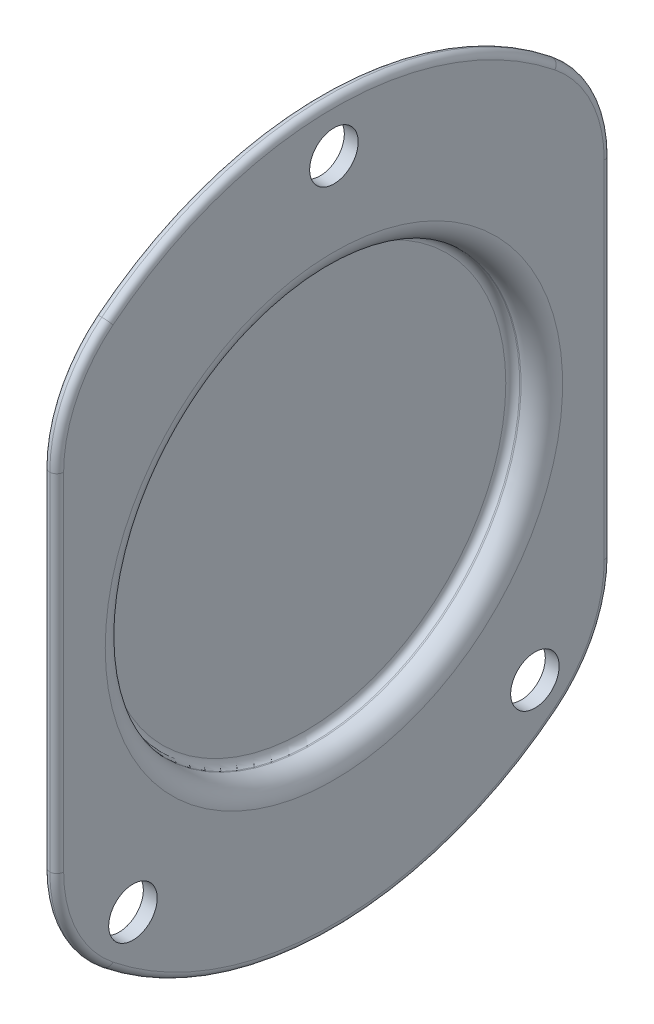
ISO-10303-21;
HEADER;
FILE_DESCRIPTION(('STEP AP214'),'2;1');
FILE_NAME('part.step','',(''),(''),'','','');
FILE_SCHEMA(('AUTOMOTIVE_DESIGN { 1 0 10303 214 1 1 1 1 }'));
ENDSEC;
DATA;
#1=APPLICATION_CONTEXT('core data for automotive mechanical design processes');
#2=APPLICATION_PROTOCOL_DEFINITION('international standard','automotive_design',2000,#1);
#3=PRODUCT_CONTEXT('',#1,'mechanical');
#4=PRODUCT('Part','Part','',(#3));
#5=PRODUCT_RELATED_PRODUCT_CATEGORY('part','',(#4));
#6=PRODUCT_DEFINITION_FORMATION('','',#4);
#7=PRODUCT_DEFINITION_CONTEXT('part definition',#1,'design');
#8=PRODUCT_DEFINITION('design','',#6,#7);
#9=PRODUCT_DEFINITION_SHAPE('','',#8);
#10=(LENGTH_UNIT() NAMED_UNIT(*) SI_UNIT(.MILLI.,.METRE.));
#11=(NAMED_UNIT(*) PLANE_ANGLE_UNIT() SI_UNIT($,.RADIAN.));
#12=(NAMED_UNIT(*) SI_UNIT($,.STERADIAN.) SOLID_ANGLE_UNIT());
#13=UNCERTAINTY_MEASURE_WITH_UNIT(LENGTH_MEASURE(1.E-05),#10,'distance_accuracy_value','');
#14=(GEOMETRIC_REPRESENTATION_CONTEXT(3) GLOBAL_UNCERTAINTY_ASSIGNED_CONTEXT((#13)) GLOBAL_UNIT_ASSIGNED_CONTEXT((#10,
#11,#12)) REPRESENTATION_CONTEXT('',''));
#15=CARTESIAN_POINT('',(0.,0.,0.));
#16=DIRECTION('',(0.,0.,1.));
#17=DIRECTION('',(1.,0.,0.));
#18=AXIS2_PLACEMENT_3D('',#15,#16,#17);
#19=CARTESIAN_POINT('',(2.2,52.,0.));
#20=DIRECTION('',(1.,0.,0.));
#21=DIRECTION('',(0.,0.,-1.));
#22=AXIS2_PLACEMENT_3D('',#19,#20,#21);
#23=PLANE('',#22);
#24=DIRECTION('',(0.,-1.,0.));
#25=VECTOR('',#24,1.);
#26=CARTESIAN_POINT('',(2.2,24.9799919935936,39.));
#27=LINE('',#26,#25);
#28=CARTESIAN_POINT('',(2.2,-24.9799919935936,39.));
#29=VERTEX_POINT('',#28);
#30=CARTESIAN_POINT('',(2.2,24.9799919935936,39.));
#31=VERTEX_POINT('',#30);
#32=EDGE_CURVE('E222',#29,#31,#27,.F.);
#33=ORIENTED_EDGE('',*,*,#32,.T.);
#34=CARTESIAN_POINT('',(2.2,24.9799919935936,20.));
#35=DIRECTION('',(1.,0.,0.));
#36=DIRECTION('',(0.,0.,-1.));
#37=AXIS2_PLACEMENT_3D('',#34,#35,#36);
#38=CIRCLE('',#37,19.);
#39=CARTESIAN_POINT('',(2.2,39.8118622397898,31.875));
#40=VERTEX_POINT('',#39);
#41=EDGE_CURVE('E224',#31,#40,#38,.F.);
#42=ORIENTED_EDGE('',*,*,#41,.T.);
#43=CARTESIAN_POINT('',(2.2,0.,0.));
#44=DIRECTION('',(1.,0.,0.));
#45=DIRECTION('',(0.,0.,-1.));
#46=AXIS2_PLACEMENT_3D('',#43,#44,#45);
#47=CIRCLE('',#46,51.);
#48=CARTESIAN_POINT('',(2.2,39.8118622397898,-31.875));
#49=VERTEX_POINT('',#48);
#50=EDGE_CURVE('E210',#40,#49,#47,.F.);
#51=ORIENTED_EDGE('',*,*,#50,.T.);
#52=CARTESIAN_POINT('',(2.2,24.9799919935936,-20.));
#53=DIRECTION('',(1.,0.,0.));
#54=DIRECTION('',(0.,0.,-1.));
#55=AXIS2_PLACEMENT_3D('',#52,#53,#54);
#56=CIRCLE('',#55,19.);
#57=CARTESIAN_POINT('',(2.2,24.9799919935936,-39.));
#58=VERTEX_POINT('',#57);
#59=EDGE_CURVE('E212',#49,#58,#56,.F.);
#60=ORIENTED_EDGE('',*,*,#59,.T.);
#61=DIRECTION('',(0.,1.,0.));
#62=VECTOR('',#61,1.);
#63=CARTESIAN_POINT('',(2.2,-24.9799919935936,-39.));
#64=LINE('',#63,#62);
#65=CARTESIAN_POINT('',(2.2,-24.9799919935936,-39.));
#66=VERTEX_POINT('',#65);
#67=EDGE_CURVE('E214',#58,#66,#64,.F.);
#68=ORIENTED_EDGE('',*,*,#67,.T.);
#69=CARTESIAN_POINT('',(2.2,-24.9799919935936,-20.));
#70=DIRECTION('',(1.,0.,0.));
#71=DIRECTION('',(0.,0.,-1.));
#72=AXIS2_PLACEMENT_3D('',#69,#70,#71);
#73=CIRCLE('',#72,19.);
#74=CARTESIAN_POINT('',(2.2,-39.8118622397898,-31.875));
#75=VERTEX_POINT('',#74);
#76=EDGE_CURVE('E216',#66,#75,#73,.F.);
#77=ORIENTED_EDGE('',*,*,#76,.T.);
#78=CARTESIAN_POINT('',(2.2,0.,0.));
#79=DIRECTION('',(1.,0.,0.));
#80=DIRECTION('',(0.,0.,-1.));
#81=AXIS2_PLACEMENT_3D('',#78,#79,#80);
#82=CIRCLE('',#81,51.);
#83=CARTESIAN_POINT('',(2.2,-39.8118622397898,31.875));
#84=VERTEX_POINT('',#83);
#85=EDGE_CURVE('E218',#75,#84,#82,.F.);
#86=ORIENTED_EDGE('',*,*,#85,.T.);
#87=CARTESIAN_POINT('',(2.2,-24.9799919935936,20.));
#88=DIRECTION('',(1.,0.,0.));
#89=DIRECTION('',(0.,0.,-1.));
#90=AXIS2_PLACEMENT_3D('',#87,#88,#89);
#91=CIRCLE('',#90,19.);
#92=EDGE_CURVE('E220',#84,#29,#91,.F.);
#93=ORIENTED_EDGE('',*,*,#92,.T.);
#94=EDGE_LOOP('',(#33,#42,#51,#60,#68,#77,#86,#93));
#95=FACE_BOUND('',#94,.T.);
#96=CARTESIAN_POINT('',(2.2,-35.,-29.));
#97=DIRECTION('',(1.,0.,0.));
#98=DIRECTION('',(0.,0.,-1.));
#99=AXIS2_PLACEMENT_3D('',#96,#97,#98);
#100=CIRCLE('',#99,3.5);
#101=CARTESIAN_POINT('',(2.2,-35.,-32.5));
#102=VERTEX_POINT('',#101);
#103=EDGE_CURVE('E167',#102,#102,#100,.T.);
#104=ORIENTED_EDGE('',*,*,#103,.T.);
#105=EDGE_LOOP('',(#104));
#106=FACE_BOUND('',#105,.T.);
#107=CARTESIAN_POINT('',(2.2,-35.,29.));
#108=DIRECTION('',(1.,0.,0.));
#109=DIRECTION('',(0.,0.,-1.));
#110=AXIS2_PLACEMENT_3D('',#107,#108,#109);
#111=CIRCLE('',#110,3.5);
#112=CARTESIAN_POINT('',(2.2,-35.,25.5));
#113=VERTEX_POINT('',#112);
#114=EDGE_CURVE('E177',#113,#113,#111,.T.);
#115=ORIENTED_EDGE('',*,*,#114,.T.);
#116=EDGE_LOOP('',(#115));
#117=FACE_BOUND('',#116,.T.);
#118=CARTESIAN_POINT('',(2.2,45.,0.));
#119=DIRECTION('',(1.,0.,0.));
#120=DIRECTION('',(0.,0.,-1.));
#121=AXIS2_PLACEMENT_3D('',#118,#119,#120);
#122=CIRCLE('',#121,3.5);
#123=CARTESIAN_POINT('',(2.2,45.,-3.5));
#124=VERTEX_POINT('',#123);
#125=EDGE_CURVE('E183',#124,#124,#122,.T.);
#126=ORIENTED_EDGE('',*,*,#125,.T.);
#127=EDGE_LOOP('',(#126));
#128=FACE_BOUND('',#127,.T.);
#129=CARTESIAN_POINT('',(2.2,0.,0.));
#130=DIRECTION('',(-1.,0.,0.));
#131=DIRECTION('',(0.,0.,1.));
#132=AXIS2_PLACEMENT_3D('',#129,#130,#131);
#133=CIRCLE('',#132,33.);
#134=CARTESIAN_POINT('',(2.2,0.,33.));
#135=VERTEX_POINT('',#134);
#136=EDGE_CURVE('E198',#135,#135,#133,.T.);
#137=ORIENTED_EDGE('',*,*,#136,.F.);
#138=EDGE_LOOP('',(#137));
#139=FACE_BOUND('',#138,.T.);
#140=ADVANCED_FACE('F34',(#95,#106,#117,#128,#139),#23,.F.);
#141=CARTESIAN_POINT('',(4.2,33.,0.));
#142=DIRECTION('',(-1.,0.,0.));
#143=DIRECTION('',(0.,0.,1.));
#144=AXIS2_PLACEMENT_3D('',#141,#142,#143);
#145=PLANE('',#144);
#146=CARTESIAN_POINT('',(4.2,0.,0.));
#147=DIRECTION('',(-1.,0.,0.));
#148=DIRECTION('',(0.,0.,1.));
#149=AXIS2_PLACEMENT_3D('',#146,#147,#148);
#150=CIRCLE('',#149,51.);
#151=CARTESIAN_POINT('',(4.2,39.8118622397898,-31.875));
#152=VERTEX_POINT('',#151);
#153=CARTESIAN_POINT('',(4.2,39.8118622397898,31.875));
#154=VERTEX_POINT('',#153);
#155=EDGE_CURVE('E227',#152,#154,#150,.F.);
#156=ORIENTED_EDGE('',*,*,#155,.T.);
#157=CARTESIAN_POINT('',(4.2,24.9799919935936,20.));
#158=DIRECTION('',(-1.,0.,0.));
#159=DIRECTION('',(0.,0.,1.));
#160=AXIS2_PLACEMENT_3D('',#157,#158,#159);
#161=CIRCLE('',#160,19.);
#162=CARTESIAN_POINT('',(4.2,24.9799919935936,39.));
#163=VERTEX_POINT('',#162);
#164=EDGE_CURVE('E12',#154,#163,#161,.F.);
#165=ORIENTED_EDGE('',*,*,#164,.T.);
#166=DIRECTION('',(0.,1.,0.));
#167=VECTOR('',#166,1.);
#168=CARTESIAN_POINT('',(4.2,-24.9799919935936,39.));
#169=LINE('',#168,#167);
#170=CARTESIAN_POINT('',(4.2,-24.9799919935936,39.));
#171=VERTEX_POINT('',#170);
#172=EDGE_CURVE('E44',#163,#171,#169,.F.);
#173=ORIENTED_EDGE('',*,*,#172,.T.);
#174=CARTESIAN_POINT('',(4.2,-24.9799919935936,20.));
#175=DIRECTION('',(-1.,0.,0.));
#176=DIRECTION('',(0.,0.,1.));
#177=AXIS2_PLACEMENT_3D('',#174,#175,#176);
#178=CIRCLE('',#177,19.);
#179=CARTESIAN_POINT('',(4.2,-39.8118622397898,31.875));
#180=VERTEX_POINT('',#179);
#181=EDGE_CURVE('E134',#171,#180,#178,.F.);
#182=ORIENTED_EDGE('',*,*,#181,.T.);
#183=CARTESIAN_POINT('',(4.2,0.,0.));
#184=DIRECTION('',(-1.,0.,0.));
#185=DIRECTION('',(0.,0.,1.));
#186=AXIS2_PLACEMENT_3D('',#183,#184,#185);
#187=CIRCLE('',#186,51.);
#188=CARTESIAN_POINT('',(4.2,-39.8118622397898,-31.875));
#189=VERTEX_POINT('',#188);
#190=EDGE_CURVE('E138',#180,#189,#187,.F.);
#191=ORIENTED_EDGE('',*,*,#190,.T.);
#192=CARTESIAN_POINT('',(4.2,-24.9799919935936,-20.));
#193=DIRECTION('',(-1.,0.,0.));
#194=DIRECTION('',(0.,0.,1.));
#195=AXIS2_PLACEMENT_3D('',#192,#193,#194);
#196=CIRCLE('',#195,19.);
#197=CARTESIAN_POINT('',(4.2,-24.9799919935936,-39.));
#198=VERTEX_POINT('',#197);
#199=EDGE_CURVE('E148',#189,#198,#196,.F.);
#200=ORIENTED_EDGE('',*,*,#199,.T.);
#201=DIRECTION('',(0.,-1.,0.));
#202=VECTOR('',#201,1.);
#203=CARTESIAN_POINT('',(4.2,24.9799919935936,-39.));
#204=LINE('',#203,#202);
#205=CARTESIAN_POINT('',(4.2,24.9799919935936,-39.));
#206=VERTEX_POINT('',#205);
#207=EDGE_CURVE('E231',#198,#206,#204,.F.);
#208=ORIENTED_EDGE('',*,*,#207,.T.);
#209=CARTESIAN_POINT('',(4.2,24.9799919935936,-20.));
#210=DIRECTION('',(-1.,0.,0.));
#211=DIRECTION('',(0.,0.,1.));
#212=AXIS2_PLACEMENT_3D('',#209,#210,#211);
#213=CIRCLE('',#212,19.);
#214=EDGE_CURVE('E229',#206,#152,#213,.F.);
#215=ORIENTED_EDGE('',*,*,#214,.T.);
#216=EDGE_LOOP('',(#156,#165,#173,#182,#191,#200,#208,#215));
#217=FACE_BOUND('',#216,.T.);
#218=CARTESIAN_POINT('',(4.2,-35.,-29.));
#219=DIRECTION('',(1.,0.,0.));
#220=DIRECTION('',(0.,0.,-1.));
#221=AXIS2_PLACEMENT_3D('',#218,#219,#220);
#222=CIRCLE('',#221,3.5);
#223=CARTESIAN_POINT('',(4.2,-35.,-32.5));
#224=VERTEX_POINT('',#223);
#225=EDGE_CURVE('E165',#224,#224,#222,.T.);
#226=ORIENTED_EDGE('',*,*,#225,.F.);
#227=EDGE_LOOP('',(#226));
#228=FACE_BOUND('',#227,.T.);
#229=CARTESIAN_POINT('',(4.2,-35.,29.));
#230=DIRECTION('',(1.,0.,0.));
#231=DIRECTION('',(0.,0.,-1.));
#232=AXIS2_PLACEMENT_3D('',#229,#230,#231);
#233=CIRCLE('',#232,3.5);
#234=CARTESIAN_POINT('',(4.2,-35.,25.5));
#235=VERTEX_POINT('',#234);
#236=EDGE_CURVE('E172',#235,#235,#233,.T.);
#237=ORIENTED_EDGE('',*,*,#236,.F.);
#238=EDGE_LOOP('',(#237));
#239=FACE_BOUND('',#238,.T.);
#240=CARTESIAN_POINT('',(4.2,45.,0.));
#241=DIRECTION('',(1.,0.,0.));
#242=DIRECTION('',(0.,0.,-1.));
#243=AXIS2_PLACEMENT_3D('',#240,#241,#242);
#244=CIRCLE('',#243,3.5);
#245=CARTESIAN_POINT('',(4.2,45.,-3.5));
#246=VERTEX_POINT('',#245);
#247=EDGE_CURVE('E180',#246,#246,#244,.T.);
#248=ORIENTED_EDGE('',*,*,#247,.F.);
#249=EDGE_LOOP('',(#248));
#250=FACE_BOUND('',#249,.T.);
#251=CARTESIAN_POINT('',(4.2,0.,0.));
#252=DIRECTION('',(-1.,0.,0.));
#253=DIRECTION('',(0.,0.,1.));
#254=AXIS2_PLACEMENT_3D('',#251,#252,#253);
#255=CIRCLE('',#254,33.);
#256=CARTESIAN_POINT('',(4.2,0.,33.));
#257=VERTEX_POINT('',#256);
#258=EDGE_CURVE('E195',#257,#257,#255,.T.);
#259=ORIENTED_EDGE('',*,*,#258,.T.);
#260=EDGE_LOOP('',(#259));
#261=FACE_BOUND('',#260,.T.);
#262=ADVANCED_FACE('F136',(#217,#228,#239,#250,#261),#145,.F.);
#263=CARTESIAN_POINT('',(-2.,29.,0.));
#264=DIRECTION('',(1.,0.,0.));
#265=DIRECTION('',(0.,0.,-1.));
#266=AXIS2_PLACEMENT_3D('',#263,#264,#265);
#267=PLANE('',#266);
#268=CARTESIAN_POINT('',(-2.,0.,0.));
#269=DIRECTION('',(-1.,0.,0.));
#270=DIRECTION('',(0.,0.,1.));
#271=AXIS2_PLACEMENT_3D('',#268,#269,#270);
#272=CIRCLE('',#271,29.);
#273=CARTESIAN_POINT('',(-2.,0.,29.));
#274=VERTEX_POINT('',#273);
#275=EDGE_CURVE('E207',#274,#274,#272,.T.);
#276=ORIENTED_EDGE('',*,*,#275,.T.);
#277=EDGE_LOOP('',(#276));
#278=FACE_BOUND('',#277,.T.);
#279=ADVANCED_FACE('F313',(#278),#267,.F.);
#280=CARTESIAN_POINT('',(1.,0.,0.));
#281=DIRECTION('',(-1.,0.,0.));
#282=DIRECTION('',(0.,0.,1.));
#283=AXIS2_PLACEMENT_3D('',#280,#281,#282);
#284=TOROIDAL_SURFACE('',#283,29.,3.);
#285=ORIENTED_EDGE('',*,*,#275,.F.);
#286=EDGE_LOOP('',(#285));
#287=FACE_BOUND('',#286,.T.);
#288=CARTESIAN_POINT('',(1.00000000000002,0.,0.));
#289=DIRECTION('',(-1.,0.,0.));
#290=DIRECTION('',(0.,0.,1.));
#291=AXIS2_PLACEMENT_3D('',#288,#289,#290);
#292=CIRCLE('',#291,32.);
#293=CARTESIAN_POINT('',(1.00000000000002,0.,32.));
#294=VERTEX_POINT('',#293);
#295=EDGE_CURVE('E204',#294,#294,#292,.T.);
#296=ORIENTED_EDGE('',*,*,#295,.T.);
#297=EDGE_LOOP('',(#296));
#298=FACE_BOUND('',#297,.T.);
#299=ADVANCED_FACE('F326',(#287,#298),#284,.T.);
#300=CARTESIAN_POINT('',(-2.,0.,0.));
#301=DIRECTION('',(-1.,0.,0.));
#302=DIRECTION('',(0.,0.,1.));
#303=AXIS2_PLACEMENT_3D('',#300,#301,#302);
#304=CYLINDRICAL_SURFACE('',#303,32.);
#305=ORIENTED_EDGE('',*,*,#295,.F.);
#306=EDGE_LOOP('',(#305));
#307=FACE_BOUND('',#306,.T.);
#308=CARTESIAN_POINT('',(1.2,0.,0.));
#309=DIRECTION('',(-1.,0.,0.));
#310=DIRECTION('',(0.,0.,1.));
#311=AXIS2_PLACEMENT_3D('',#308,#309,#310);
#312=CIRCLE('',#311,32.);
#313=CARTESIAN_POINT('',(1.2,0.,32.));
#314=VERTEX_POINT('',#313);
#315=EDGE_CURVE('E201',#314,#314,#312,.T.);
#316=ORIENTED_EDGE('',*,*,#315,.T.);
#317=EDGE_LOOP('',(#316));
#318=FACE_BOUND('',#317,.T.);
#319=ADVANCED_FACE('F322',(#307,#318),#304,.T.);
#320=CARTESIAN_POINT('',(1.2,0.,0.));
#321=DIRECTION('',(-1.,0.,0.));
#322=DIRECTION('',(0.,0.,1.));
#323=AXIS2_PLACEMENT_3D('',#320,#321,#322);
#324=TOROIDAL_SURFACE('',#323,33.,1.);
#325=ORIENTED_EDGE('',*,*,#315,.F.);
#326=EDGE_LOOP('',(#325));
#327=FACE_BOUND('',#326,.T.);
#328=ORIENTED_EDGE('',*,*,#136,.T.);
#329=EDGE_LOOP('',(#328));
#330=FACE_BOUND('',#329,.T.);
#331=ADVANCED_FACE('F318',(#327,#330),#324,.F.);
#332=CARTESIAN_POINT('',(1.2,0.,0.));
#333=DIRECTION('',(-1.,0.,0.));
#334=DIRECTION('',(0.,0.,1.));
#335=AXIS2_PLACEMENT_3D('',#332,#333,#334);
#336=TOROIDAL_SURFACE('',#335,33.,3.);
#337=ORIENTED_EDGE('',*,*,#258,.F.);
#338=EDGE_LOOP('',(#337));
#339=FACE_BOUND('',#338,.T.);
#340=CARTESIAN_POINT('',(1.19999999999998,0.,0.));
#341=DIRECTION('',(-1.,0.,0.));
#342=DIRECTION('',(0.,0.,1.));
#343=AXIS2_PLACEMENT_3D('',#340,#341,#342);
#344=CIRCLE('',#343,30.);
#345=CARTESIAN_POINT('',(1.19999999999998,0.,30.));
#346=VERTEX_POINT('',#345);
#347=EDGE_CURVE('E192',#346,#346,#344,.T.);
#348=ORIENTED_EDGE('',*,*,#347,.T.);
#349=EDGE_LOOP('',(#348));
#350=FACE_BOUND('',#349,.T.);
#351=ADVANCED_FACE('F321',(#339,#350),#336,.T.);
#352=CARTESIAN_POINT('',(-2.,0.,0.));
#353=DIRECTION('',(-1.,0.,0.));
#354=DIRECTION('',(0.,0.,1.));
#355=AXIS2_PLACEMENT_3D('',#352,#353,#354);
#356=CYLINDRICAL_SURFACE('',#355,30.);
#357=ORIENTED_EDGE('',*,*,#347,.F.);
#358=EDGE_LOOP('',(#357));
#359=FACE_BOUND('',#358,.T.);
#360=CARTESIAN_POINT('',(1.00000000000001,0.,0.));
#361=DIRECTION('',(-1.,0.,0.));
#362=DIRECTION('',(0.,0.,1.));
#363=AXIS2_PLACEMENT_3D('',#360,#361,#362);
#364=CIRCLE('',#363,30.);
#365=CARTESIAN_POINT('',(1.00000000000001,0.,30.));
#366=VERTEX_POINT('',#365);
#367=EDGE_CURVE('E189',#366,#366,#364,.T.);
#368=ORIENTED_EDGE('',*,*,#367,.T.);
#369=EDGE_LOOP('',(#368));
#370=FACE_BOUND('',#369,.T.);
#371=ADVANCED_FACE('F516',(#359,#370),#356,.F.);
#372=CARTESIAN_POINT('',(1.,0.,0.));
#373=DIRECTION('',(-1.,0.,0.));
#374=DIRECTION('',(0.,0.,1.));
#375=AXIS2_PLACEMENT_3D('',#372,#373,#374);
#376=TOROIDAL_SURFACE('',#375,29.,1.);
#377=ORIENTED_EDGE('',*,*,#367,.F.);
#378=EDGE_LOOP('',(#377));
#379=FACE_BOUND('',#378,.T.);
#380=CARTESIAN_POINT('',(0.,0.,0.));
#381=DIRECTION('',(-1.,0.,0.));
#382=DIRECTION('',(0.,0.,1.));
#383=AXIS2_PLACEMENT_3D('',#380,#381,#382);
#384=CIRCLE('',#383,29.);
#385=CARTESIAN_POINT('',(0.,0.,29.));
#386=VERTEX_POINT('',#385);
#387=EDGE_CURVE('E186',#386,#386,#384,.T.);
#388=ORIENTED_EDGE('',*,*,#387,.T.);
#389=EDGE_LOOP('',(#388));
#390=FACE_BOUND('',#389,.T.);
#391=ADVANCED_FACE('F507',(#379,#390),#376,.F.);
#392=CARTESIAN_POINT('',(0.,0.,0.));
#393=DIRECTION('',(-1.,0.,0.));
#394=DIRECTION('',(0.,0.,1.));
#395=AXIS2_PLACEMENT_3D('',#392,#393,#394);
#396=PLANE('',#395);
#397=ORIENTED_EDGE('',*,*,#387,.F.);
#398=EDGE_LOOP('',(#397));
#399=FACE_BOUND('',#398,.T.);
#400=ADVANCED_FACE('F490',(#399),#396,.F.);
#401=CARTESIAN_POINT('',(-5.8,45.,0.));
#402=DIRECTION('',(1.,0.,0.));
#403=DIRECTION('',(0.,0.,-1.));
#404=AXIS2_PLACEMENT_3D('',#401,#402,#403);
#405=CYLINDRICAL_SURFACE('',#404,3.5);
#406=ORIENTED_EDGE('',*,*,#247,.T.);
#407=EDGE_LOOP('',(#406));
#408=FACE_BOUND('',#407,.T.);
#409=ORIENTED_EDGE('',*,*,#125,.F.);
#410=EDGE_LOOP('',(#409));
#411=FACE_BOUND('',#410,.T.);
#412=ADVANCED_FACE('F481',(#408,#411),#405,.F.);
#413=CARTESIAN_POINT('',(-5.8,-35.,29.));
#414=DIRECTION('',(1.,0.,0.));
#415=DIRECTION('',(0.,0.,-1.));
#416=AXIS2_PLACEMENT_3D('',#413,#414,#415);
#417=CYLINDRICAL_SURFACE('',#416,3.5);
#418=ORIENTED_EDGE('',*,*,#236,.T.);
#419=EDGE_LOOP('',(#418));
#420=FACE_BOUND('',#419,.T.);
#421=ORIENTED_EDGE('',*,*,#114,.F.);
#422=EDGE_LOOP('',(#421));
#423=FACE_BOUND('',#422,.T.);
#424=ADVANCED_FACE('F306',(#420,#423),#417,.F.);
#425=CARTESIAN_POINT('',(-5.8,-35.,-29.));
#426=DIRECTION('',(1.,0.,0.));
#427=DIRECTION('',(0.,0.,-1.));
#428=AXIS2_PLACEMENT_3D('',#425,#426,#427);
#429=CYLINDRICAL_SURFACE('',#428,3.5);
#430=ORIENTED_EDGE('',*,*,#225,.T.);
#431=EDGE_LOOP('',(#430));
#432=FACE_BOUND('',#431,.T.);
#433=ORIENTED_EDGE('',*,*,#103,.F.);
#434=EDGE_LOOP('',(#433));
#435=FACE_BOUND('',#434,.T.);
#436=ADVANCED_FACE('F301',(#432,#435),#429,.F.);
#437=CARTESIAN_POINT('',(3.2,-24.9799919935936,-20.));
#438=DIRECTION('',(-1.,0.,0.));
#439=DIRECTION('',(0.,0.,1.));
#440=AXIS2_PLACEMENT_3D('',#437,#438,#439);
#441=TOROIDAL_SURFACE('',#440,19.,1.);
#442=CARTESIAN_POINT('',(3.2,-24.9799919935936,-39.));
#443=DIRECTION('',(0.,1.,0.));
#444=DIRECTION('',(0.,0.,1.));
#445=AXIS2_PLACEMENT_3D('',#442,#443,#444);
#446=CIRCLE('',#445,1.);
#447=CARTESIAN_POINT('',(3.2,-24.9799919935936,-40.));
#448=VERTEX_POINT('',#447);
#449=EDGE_CURVE('E155',#198,#448,#446,.T.);
#450=ORIENTED_EDGE('',*,*,#449,.F.);
#451=ORIENTED_EDGE('',*,*,#199,.F.);
#452=CARTESIAN_POINT('',(3.2,-39.8118622397898,-31.875));
#453=DIRECTION('',(0.,-0.625000000000001,0.780624749799799));
#454=DIRECTION('',(0.,-0.780624749799799,-0.625000000000001));
#455=AXIS2_PLACEMENT_3D('',#452,#453,#454);
#456=CIRCLE('',#455,1.);
#457=CARTESIAN_POINT('',(3.2,-40.5924869895896,-32.5));
#458=VERTEX_POINT('',#457);
#459=EDGE_CURVE('E38',#458,#189,#456,.T.);
#460=ORIENTED_EDGE('',*,*,#459,.F.);
#461=CARTESIAN_POINT('',(3.2,-24.9799919935936,-20.));
#462=DIRECTION('',(-1.,0.,0.));
#463=DIRECTION('',(0.,0.,1.));
#464=AXIS2_PLACEMENT_3D('',#461,#462,#463);
#465=CIRCLE('',#464,20.);
#466=EDGE_CURVE('E82',#448,#458,#465,.T.);
#467=ORIENTED_EDGE('',*,*,#466,.F.);
#468=EDGE_LOOP('',(#450,#451,#460,#467));
#469=FACE_BOUND('',#468,.T.);
#470=ADVANCED_FACE('F36',(#469),#441,.T.);
#471=CARTESIAN_POINT('',(3.2,0.,0.));
#472=DIRECTION('',(-1.,0.,0.));
#473=DIRECTION('',(0.,0.,1.));
#474=AXIS2_PLACEMENT_3D('',#471,#472,#473);
#475=TOROIDAL_SURFACE('',#474,51.,1.);
#476=ORIENTED_EDGE('',*,*,#459,.T.);
#477=ORIENTED_EDGE('',*,*,#190,.F.);
#478=CARTESIAN_POINT('',(3.2,-39.8118622397898,31.875));
#479=DIRECTION('',(0.,0.625000000000001,0.780624749799799));
#480=DIRECTION('',(0.,-0.780624749799799,0.625000000000001));
#481=AXIS2_PLACEMENT_3D('',#478,#479,#480);
#482=CIRCLE('',#481,1.);
#483=CARTESIAN_POINT('',(3.2,-40.5924869895896,32.5));
#484=VERTEX_POINT('',#483);
#485=EDGE_CURVE('E146',#484,#180,#482,.T.);
#486=ORIENTED_EDGE('',*,*,#485,.F.);
#487=CARTESIAN_POINT('',(3.2,0.,0.));
#488=DIRECTION('',(-1.,0.,0.));
#489=DIRECTION('',(0.,0.,1.));
#490=AXIS2_PLACEMENT_3D('',#487,#488,#489);
#491=CIRCLE('',#490,52.);
#492=EDGE_CURVE('E156',#458,#484,#491,.T.);
#493=ORIENTED_EDGE('',*,*,#492,.F.);
#494=EDGE_LOOP('',(#476,#477,#486,#493));
#495=FACE_BOUND('',#494,.T.);
#496=ADVANCED_FACE('F144',(#495),#475,.T.);
#497=CARTESIAN_POINT('',(3.2,-24.9799919935936,-20.));
#498=DIRECTION('',(1.,0.,0.));
#499=DIRECTION('',(0.,0.,-1.));
#500=AXIS2_PLACEMENT_3D('',#497,#498,#499);
#501=TOROIDAL_SURFACE('',#500,19.,1.);
#502=CARTESIAN_POINT('',(3.2,-24.9799919935936,-39.));
#503=DIRECTION('',(0.,1.,0.));
#504=DIRECTION('',(0.,0.,1.));
#505=AXIS2_PLACEMENT_3D('',#502,#503,#504);
#506=CIRCLE('',#505,1.);
#507=EDGE_CURVE('E276',#448,#66,#506,.T.);
#508=ORIENTED_EDGE('',*,*,#507,.F.);
#509=ORIENTED_EDGE('',*,*,#466,.T.);
#510=CARTESIAN_POINT('',(3.2,-39.8118622397898,-31.875));
#511=DIRECTION('',(0.,-0.625000000000001,0.780624749799799));
#512=DIRECTION('',(0.,-0.780624749799799,-0.625000000000001));
#513=AXIS2_PLACEMENT_3D('',#510,#511,#512);
#514=CIRCLE('',#513,1.);
#515=EDGE_CURVE('E159',#75,#458,#514,.T.);
#516=ORIENTED_EDGE('',*,*,#515,.F.);
#517=ORIENTED_EDGE('',*,*,#76,.F.);
#518=EDGE_LOOP('',(#508,#509,#516,#517));
#519=FACE_BOUND('',#518,.T.);
#520=ADVANCED_FACE('F284',(#519),#501,.T.);
#521=CARTESIAN_POINT('',(3.2,52.,-39.));
#522=DIRECTION('',(0.,1.,0.));
#523=DIRECTION('',(0.,0.,1.));
#524=AXIS2_PLACEMENT_3D('',#521,#522,#523);
#525=CYLINDRICAL_SURFACE('',#524,1.);
#526=ORIENTED_EDGE('',*,*,#207,.F.);
#527=ORIENTED_EDGE('',*,*,#449,.T.);
#528=DIRECTION('',(0.,-1.,0.));
#529=VECTOR('',#528,1.);
#530=CARTESIAN_POINT('',(3.2,-24.9799919935936,-40.));
#531=LINE('',#530,#529);
#532=CARTESIAN_POINT('',(3.2,24.9799919935936,-40.));
#533=VERTEX_POINT('',#532);
#534=EDGE_CURVE('E273',#533,#448,#531,.T.);
#535=ORIENTED_EDGE('',*,*,#534,.F.);
#536=CARTESIAN_POINT('',(3.2,24.9799919935936,-39.));
#537=DIRECTION('',(0.,1.,0.));
#538=DIRECTION('',(0.,0.,1.));
#539=AXIS2_PLACEMENT_3D('',#536,#537,#538);
#540=CIRCLE('',#539,1.);
#541=EDGE_CURVE('E270',#206,#533,#540,.T.);
#542=ORIENTED_EDGE('',*,*,#541,.F.);
#543=EDGE_LOOP('',(#526,#527,#535,#542));
#544=FACE_BOUND('',#543,.T.);
#545=ADVANCED_FACE('F293',(#544),#525,.T.);
#546=CARTESIAN_POINT('',(3.2,-24.9799919935936,20.));
#547=DIRECTION('',(-1.,0.,0.));
#548=DIRECTION('',(0.,0.,1.));
#549=AXIS2_PLACEMENT_3D('',#546,#547,#548);
#550=TOROIDAL_SURFACE('',#549,19.,1.);
#551=ORIENTED_EDGE('',*,*,#485,.T.);
#552=ORIENTED_EDGE('',*,*,#181,.F.);
#553=CARTESIAN_POINT('',(3.2,-24.9799919935936,39.));
#554=DIRECTION('',(0.,1.,0.));
#555=DIRECTION('',(0.,0.,1.));
#556=AXIS2_PLACEMENT_3D('',#553,#554,#555);
#557=CIRCLE('',#556,1.);
#558=CARTESIAN_POINT('',(3.2,-24.9799919935936,40.));
#559=VERTEX_POINT('',#558);
#560=EDGE_CURVE('E268',#559,#171,#557,.T.);
#561=ORIENTED_EDGE('',*,*,#560,.F.);
#562=CARTESIAN_POINT('',(3.2,-24.9799919935936,20.));
#563=DIRECTION('',(-1.,0.,0.));
#564=DIRECTION('',(0.,0.,1.));
#565=AXIS2_PLACEMENT_3D('',#562,#563,#564);
#566=CIRCLE('',#565,20.);
#567=EDGE_CURVE('E153',#484,#559,#566,.T.);
#568=ORIENTED_EDGE('',*,*,#567,.F.);
#569=EDGE_LOOP('',(#551,#552,#561,#568));
#570=FACE_BOUND('',#569,.T.);
#571=ADVANCED_FACE('F151',(#570),#550,.T.);
#572=CARTESIAN_POINT('',(3.2,0.,0.));
#573=DIRECTION('',(1.,0.,0.));
#574=DIRECTION('',(0.,0.,-1.));
#575=AXIS2_PLACEMENT_3D('',#572,#573,#574);
#576=TOROIDAL_SURFACE('',#575,51.,1.);
#577=ORIENTED_EDGE('',*,*,#515,.T.);
#578=ORIENTED_EDGE('',*,*,#492,.T.);
#579=CARTESIAN_POINT('',(3.2,-39.8118622397898,31.875));
#580=DIRECTION('',(0.,0.625000000000001,0.780624749799799));
#581=DIRECTION('',(0.,-0.780624749799799,0.625000000000001));
#582=AXIS2_PLACEMENT_3D('',#579,#580,#581);
#583=CIRCLE('',#582,1.);
#584=EDGE_CURVE('E265',#84,#484,#583,.T.);
#585=ORIENTED_EDGE('',*,*,#584,.F.);
#586=ORIENTED_EDGE('',*,*,#85,.F.);
#587=EDGE_LOOP('',(#577,#578,#585,#586));
#588=FACE_BOUND('',#587,.T.);
#589=ADVANCED_FACE('F281',(#588),#576,.T.);
#590=CARTESIAN_POINT('',(3.2,52.,-39.));
#591=DIRECTION('',(0.,-1.,0.));
#592=DIRECTION('',(0.,0.,-1.));
#593=AXIS2_PLACEMENT_3D('',#590,#591,#592);
#594=CYLINDRICAL_SURFACE('',#593,1.);
#595=ORIENTED_EDGE('',*,*,#507,.T.);
#596=ORIENTED_EDGE('',*,*,#67,.F.);
#597=CARTESIAN_POINT('',(3.2,24.9799919935936,-39.));
#598=DIRECTION('',(0.,1.,0.));
#599=DIRECTION('',(0.,0.,1.));
#600=AXIS2_PLACEMENT_3D('',#597,#598,#599);
#601=CIRCLE('',#600,1.);
#602=EDGE_CURVE('E262',#533,#58,#601,.T.);
#603=ORIENTED_EDGE('',*,*,#602,.F.);
#604=ORIENTED_EDGE('',*,*,#534,.T.);
#605=EDGE_LOOP('',(#595,#596,#603,#604));
#606=FACE_BOUND('',#605,.T.);
#607=ADVANCED_FACE('F288',(#606),#594,.T.);
#608=CARTESIAN_POINT('',(3.2,24.9799919935936,-20.));
#609=DIRECTION('',(-1.,0.,0.));
#610=DIRECTION('',(0.,0.,1.));
#611=AXIS2_PLACEMENT_3D('',#608,#609,#610);
#612=TOROIDAL_SURFACE('',#611,19.,1.);
#613=ORIENTED_EDGE('',*,*,#214,.F.);
#614=ORIENTED_EDGE('',*,*,#541,.T.);
#615=CARTESIAN_POINT('',(3.2,24.9799919935936,-20.));
#616=DIRECTION('',(-1.,0.,0.));
#617=DIRECTION('',(0.,0.,1.));
#618=AXIS2_PLACEMENT_3D('',#615,#616,#617);
#619=CIRCLE('',#618,20.);
#620=CARTESIAN_POINT('',(3.2,40.5924869895896,-32.5));
#621=VERTEX_POINT('',#620);
#622=EDGE_CURVE('E259',#621,#533,#619,.T.);
#623=ORIENTED_EDGE('',*,*,#622,.F.);
#624=CARTESIAN_POINT('',(3.2,39.8118622397898,-31.875));
#625=DIRECTION('',(0.,0.625000000000001,0.780624749799799));
#626=DIRECTION('',(0.,-0.780624749799799,0.625000000000001));
#627=AXIS2_PLACEMENT_3D('',#624,#625,#626);
#628=CIRCLE('',#627,1.);
#629=EDGE_CURVE('E256',#152,#621,#628,.T.);
#630=ORIENTED_EDGE('',*,*,#629,.F.);
#631=EDGE_LOOP('',(#613,#614,#623,#630));
#632=FACE_BOUND('',#631,.T.);
#633=ADVANCED_FACE('F296',(#632),#612,.T.);
#634=CARTESIAN_POINT('',(3.2,52.,39.));
#635=DIRECTION('',(0.,-1.,0.));
#636=DIRECTION('',(0.,0.,-1.));
#637=AXIS2_PLACEMENT_3D('',#634,#635,#636);
#638=CYLINDRICAL_SURFACE('',#637,1.);
#639=ORIENTED_EDGE('',*,*,#560,.T.);
#640=ORIENTED_EDGE('',*,*,#172,.F.);
#641=CARTESIAN_POINT('',(3.2,24.9799919935936,39.));
#642=DIRECTION('',(0.,1.,0.));
#643=DIRECTION('',(0.,0.,1.));
#644=AXIS2_PLACEMENT_3D('',#641,#642,#643);
#645=CIRCLE('',#644,1.);
#646=CARTESIAN_POINT('',(3.2,24.9799919935936,40.));
#647=VERTEX_POINT('',#646);
#648=EDGE_CURVE('E53',#647,#163,#645,.T.);
#649=ORIENTED_EDGE('',*,*,#648,.F.);
#650=DIRECTION('',(0.,1.,0.));
#651=VECTOR('',#650,1.);
#652=CARTESIAN_POINT('',(3.2,24.9799919935936,40.));
#653=LINE('',#652,#651);
#654=EDGE_CURVE('E250',#559,#647,#653,.T.);
#655=ORIENTED_EDGE('',*,*,#654,.F.);
#656=EDGE_LOOP('',(#639,#640,#649,#655));
#657=FACE_BOUND('',#656,.T.);
#658=ADVANCED_FACE('F359',(#657),#638,.T.);
#659=CARTESIAN_POINT('',(3.2,-24.9799919935936,20.));
#660=DIRECTION('',(1.,0.,0.));
#661=DIRECTION('',(0.,0.,-1.));
#662=AXIS2_PLACEMENT_3D('',#659,#660,#661);
#663=TOROIDAL_SURFACE('',#662,19.,1.);
#664=ORIENTED_EDGE('',*,*,#584,.T.);
#665=ORIENTED_EDGE('',*,*,#567,.T.);
#666=CARTESIAN_POINT('',(3.2,-24.9799919935936,39.));
#667=DIRECTION('',(0.,1.,0.));
#668=DIRECTION('',(0.,0.,1.));
#669=AXIS2_PLACEMENT_3D('',#666,#667,#668);
#670=CIRCLE('',#669,1.);
#671=EDGE_CURVE('E247',#29,#559,#670,.T.);
#672=ORIENTED_EDGE('',*,*,#671,.F.);
#673=ORIENTED_EDGE('',*,*,#92,.F.);
#674=EDGE_LOOP('',(#664,#665,#672,#673));
#675=FACE_BOUND('',#674,.T.);
#676=ADVANCED_FACE('F355',(#675),#663,.T.);
#677=CARTESIAN_POINT('',(3.2,24.9799919935936,-20.));
#678=DIRECTION('',(1.,0.,0.));
#679=DIRECTION('',(0.,0.,-1.));
#680=AXIS2_PLACEMENT_3D('',#677,#678,#679);
#681=TOROIDAL_SURFACE('',#680,19.,1.);
#682=ORIENTED_EDGE('',*,*,#602,.T.);
#683=ORIENTED_EDGE('',*,*,#59,.F.);
#684=CARTESIAN_POINT('',(3.2,39.8118622397898,-31.875));
#685=DIRECTION('',(0.,0.625000000000001,0.780624749799799));
#686=DIRECTION('',(0.,-0.780624749799799,0.625000000000001));
#687=AXIS2_PLACEMENT_3D('',#684,#685,#686);
#688=CIRCLE('',#687,1.);
#689=EDGE_CURVE('E244',#621,#49,#688,.T.);
#690=ORIENTED_EDGE('',*,*,#689,.F.);
#691=ORIENTED_EDGE('',*,*,#622,.T.);
#692=EDGE_LOOP('',(#682,#683,#690,#691));
#693=FACE_BOUND('',#692,.T.);
#694=ADVANCED_FACE('F351',(#693),#681,.T.);
#695=CARTESIAN_POINT('',(3.2,0.,0.));
#696=DIRECTION('',(-1.,0.,0.));
#697=DIRECTION('',(0.,0.,1.));
#698=AXIS2_PLACEMENT_3D('',#695,#696,#697);
#699=TOROIDAL_SURFACE('',#698,51.,1.);
#700=CARTESIAN_POINT('',(3.2,39.8118622397898,31.875));
#701=DIRECTION('',(0.,-0.625000000000001,0.780624749799799));
#702=DIRECTION('',(0.,-0.780624749799799,-0.625000000000001));
#703=AXIS2_PLACEMENT_3D('',#700,#701,#702);
#704=CIRCLE('',#703,1.);
#705=CARTESIAN_POINT('',(3.2,40.5924869895896,32.5));
#706=VERTEX_POINT('',#705);
#707=EDGE_CURVE('E254',#154,#706,#704,.T.);
#708=ORIENTED_EDGE('',*,*,#707,.F.);
#709=ORIENTED_EDGE('',*,*,#155,.F.);
#710=ORIENTED_EDGE('',*,*,#629,.T.);
#711=CARTESIAN_POINT('',(3.2,0.,0.));
#712=DIRECTION('',(-1.,0.,0.));
#713=DIRECTION('',(0.,0.,1.));
#714=AXIS2_PLACEMENT_3D('',#711,#712,#713);
#715=CIRCLE('',#714,52.);
#716=EDGE_CURVE('E241',#706,#621,#715,.T.);
#717=ORIENTED_EDGE('',*,*,#716,.F.);
#718=EDGE_LOOP('',(#708,#709,#710,#717));
#719=FACE_BOUND('',#718,.T.);
#720=ADVANCED_FACE('F348',(#719),#699,.T.);
#721=CARTESIAN_POINT('',(3.2,24.9799919935936,20.));
#722=DIRECTION('',(-1.,0.,0.));
#723=DIRECTION('',(0.,0.,1.));
#724=AXIS2_PLACEMENT_3D('',#721,#722,#723);
#725=TOROIDAL_SURFACE('',#724,19.,1.);
#726=ORIENTED_EDGE('',*,*,#164,.F.);
#727=ORIENTED_EDGE('',*,*,#707,.T.);
#728=CARTESIAN_POINT('',(3.2,24.9799919935936,20.));
#729=DIRECTION('',(-1.,0.,0.));
#730=DIRECTION('',(0.,0.,1.));
#731=AXIS2_PLACEMENT_3D('',#728,#729,#730);
#732=CIRCLE('',#731,20.);
#733=EDGE_CURVE('E239',#647,#706,#732,.T.);
#734=ORIENTED_EDGE('',*,*,#733,.F.);
#735=ORIENTED_EDGE('',*,*,#648,.T.);
#736=EDGE_LOOP('',(#726,#727,#734,#735));
#737=FACE_BOUND('',#736,.T.);
#738=ADVANCED_FACE('F344',(#737),#725,.T.);
#739=CARTESIAN_POINT('',(3.2,52.,39.));
#740=DIRECTION('',(0.,1.,0.));
#741=DIRECTION('',(0.,0.,1.));
#742=AXIS2_PLACEMENT_3D('',#739,#740,#741);
#743=CYLINDRICAL_SURFACE('',#742,1.);
#744=ORIENTED_EDGE('',*,*,#671,.T.);
#745=ORIENTED_EDGE('',*,*,#654,.T.);
#746=CARTESIAN_POINT('',(3.2,24.9799919935936,39.));
#747=DIRECTION('',(0.,1.,0.));
#748=DIRECTION('',(0.,0.,1.));
#749=AXIS2_PLACEMENT_3D('',#746,#747,#748);
#750=CIRCLE('',#749,1.);
#751=EDGE_CURVE('E236',#31,#647,#750,.T.);
#752=ORIENTED_EDGE('',*,*,#751,.F.);
#753=ORIENTED_EDGE('',*,*,#32,.F.);
#754=EDGE_LOOP('',(#744,#745,#752,#753));
#755=FACE_BOUND('',#754,.T.);
#756=ADVANCED_FACE('F340',(#755),#743,.T.);
#757=CARTESIAN_POINT('',(3.2,0.,0.));
#758=DIRECTION('',(1.,0.,0.));
#759=DIRECTION('',(0.,0.,-1.));
#760=AXIS2_PLACEMENT_3D('',#757,#758,#759);
#761=TOROIDAL_SURFACE('',#760,51.,1.);
#762=ORIENTED_EDGE('',*,*,#689,.T.);
#763=ORIENTED_EDGE('',*,*,#50,.F.);
#764=CARTESIAN_POINT('',(3.2,39.8118622397898,31.875));
#765=DIRECTION('',(0.,-0.625000000000001,0.780624749799799));
#766=DIRECTION('',(0.,-0.780624749799799,-0.625000000000001));
#767=AXIS2_PLACEMENT_3D('',#764,#765,#766);
#768=CIRCLE('',#767,1.);
#769=EDGE_CURVE('E94',#706,#40,#768,.T.);
#770=ORIENTED_EDGE('',*,*,#769,.F.);
#771=ORIENTED_EDGE('',*,*,#716,.T.);
#772=EDGE_LOOP('',(#762,#763,#770,#771));
#773=FACE_BOUND('',#772,.T.);
#774=ADVANCED_FACE('F337',(#773),#761,.T.);
#775=CARTESIAN_POINT('',(3.2,24.9799919935936,20.));
#776=DIRECTION('',(1.,0.,0.));
#777=DIRECTION('',(0.,0.,-1.));
#778=AXIS2_PLACEMENT_3D('',#775,#776,#777);
#779=TOROIDAL_SURFACE('',#778,19.,1.);
#780=ORIENTED_EDGE('',*,*,#751,.T.);
#781=ORIENTED_EDGE('',*,*,#733,.T.);
#782=ORIENTED_EDGE('',*,*,#769,.T.);
#783=ORIENTED_EDGE('',*,*,#41,.F.);
#784=EDGE_LOOP('',(#780,#781,#782,#783));
#785=FACE_BOUND('',#784,.T.);
#786=ADVANCED_FACE('F334',(#785),#779,.T.);
#787=CLOSED_SHELL('',(#140,#262,#279,#299,#319,#331,#351,#371,#391,#400,#412,#424,#436,#470,
#496,#520,#545,#571,#589,#607,#633,#658,#676,#694,#720,#738,#756,#774,#786));
#788=MANIFOLD_SOLID_BREP('B2',#787);
#789=ADVANCED_BREP_SHAPE_REPRESENTATION('',(#18,#788),#14);
#790=SHAPE_DEFINITION_REPRESENTATION(#9,#789);
ENDSEC;
END-ISO-10303-21;
